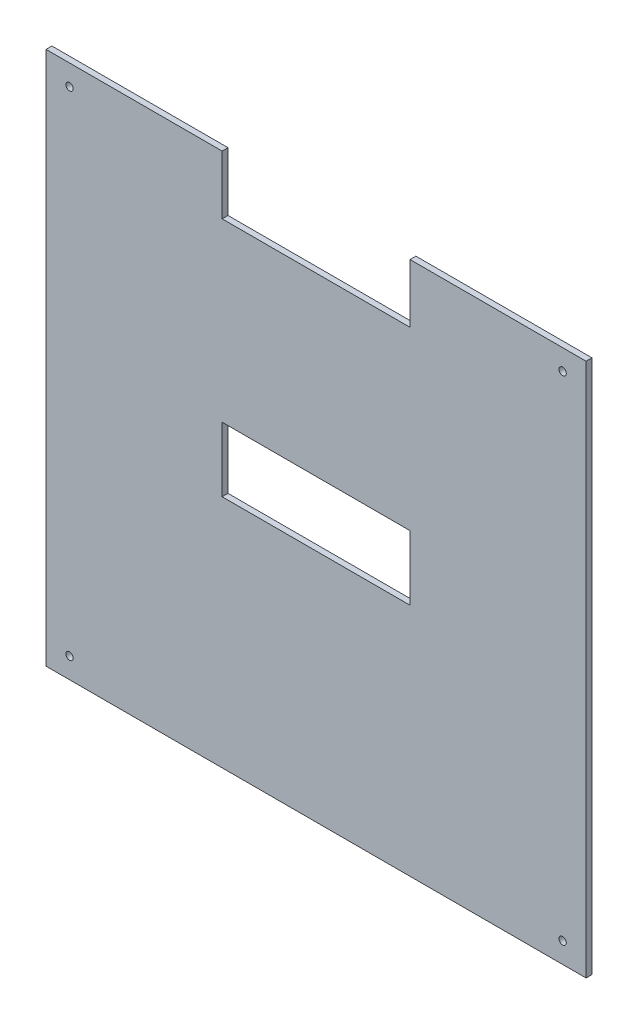
ISO-10303-21;
HEADER;
FILE_DESCRIPTION(('STEP AP214'),'2;1');
FILE_NAME('part.step','',(''),(''),'','','');
FILE_SCHEMA(('AUTOMOTIVE_DESIGN { 1 0 10303 214 1 1 1 1 }'));
ENDSEC;
DATA;
#1=APPLICATION_CONTEXT('core data for automotive mechanical design processes');
#2=APPLICATION_PROTOCOL_DEFINITION('international standard','automotive_design',2000,#1);
#3=PRODUCT_CONTEXT('',#1,'mechanical');
#4=PRODUCT('Part','Part','',(#3));
#5=PRODUCT_RELATED_PRODUCT_CATEGORY('part','',(#4));
#6=PRODUCT_DEFINITION_FORMATION('','',#4);
#7=PRODUCT_DEFINITION_CONTEXT('part definition',#1,'design');
#8=PRODUCT_DEFINITION('design','',#6,#7);
#9=PRODUCT_DEFINITION_SHAPE('','',#8);
#10=(LENGTH_UNIT() NAMED_UNIT(*) SI_UNIT(.MILLI.,.METRE.));
#11=(NAMED_UNIT(*) PLANE_ANGLE_UNIT() SI_UNIT($,.RADIAN.));
#12=(NAMED_UNIT(*) SI_UNIT($,.STERADIAN.) SOLID_ANGLE_UNIT());
#13=UNCERTAINTY_MEASURE_WITH_UNIT(LENGTH_MEASURE(1.E-05),#10,'distance_accuracy_value','');
#14=(GEOMETRIC_REPRESENTATION_CONTEXT(3) GLOBAL_UNCERTAINTY_ASSIGNED_CONTEXT((#13)) GLOBAL_UNIT_ASSIGNED_CONTEXT((#10,
#11,#12)) REPRESENTATION_CONTEXT('',''));
#15=CARTESIAN_POINT('',(0.,0.,0.));
#16=DIRECTION('',(0.,0.,1.));
#17=DIRECTION('',(1.,0.,0.));
#18=AXIS2_PLACEMENT_3D('',#15,#16,#17);
#19=CARTESIAN_POINT('',(0.,182.,2.));
#20=DIRECTION('',(0.,-1.,0.));
#21=DIRECTION('',(0.,0.,-1.));
#22=AXIS2_PLACEMENT_3D('',#19,#20,#21);
#23=PLANE('',#22);
#24=DIRECTION('',(-1.,0.,0.));
#25=VECTOR('',#24,1.);
#26=CARTESIAN_POINT('',(0.,182.,2.));
#27=LINE('',#26,#25);
#28=CARTESIAN_POINT('',(60.,182.,2.));
#29=VERTEX_POINT('',#28);
#30=CARTESIAN_POINT('',(0.,182.,2.));
#31=VERTEX_POINT('',#30);
#32=EDGE_CURVE('E219',#29,#31,#27,.T.);
#33=ORIENTED_EDGE('',*,*,#32,.F.);
#34=DIRECTION('',(0.,0.,-1.));
#35=VECTOR('',#34,1.);
#36=CARTESIAN_POINT('',(60.,182.,2.));
#37=LINE('',#36,#35);
#38=CARTESIAN_POINT('',(60.,182.,0.));
#39=VERTEX_POINT('',#38);
#40=EDGE_CURVE('E171',#29,#39,#37,.T.);
#41=ORIENTED_EDGE('',*,*,#40,.T.);
#42=DIRECTION('',(-1.,0.,0.));
#43=VECTOR('',#42,1.);
#44=CARTESIAN_POINT('',(0.,182.,0.));
#45=LINE('',#44,#43);
#46=CARTESIAN_POINT('',(0.,182.,0.));
#47=VERTEX_POINT('',#46);
#48=EDGE_CURVE('E230',#39,#47,#45,.T.);
#49=ORIENTED_EDGE('',*,*,#48,.T.);
#50=DIRECTION('',(0.,0.,-1.));
#51=VECTOR('',#50,1.);
#52=CARTESIAN_POINT('',(0.,182.,2.));
#53=LINE('',#52,#51);
#54=EDGE_CURVE('E223',#31,#47,#53,.T.);
#55=ORIENTED_EDGE('',*,*,#54,.F.);
#56=EDGE_LOOP('',(#33,#41,#49,#55));
#57=FACE_BOUND('',#56,.T.);
#58=ADVANCED_FACE('F34',(#57),#23,.F.);
#59=CARTESIAN_POINT('',(0.,0.,2.));
#60=DIRECTION('',(0.,0.,-1.));
#61=DIRECTION('',(-1.,0.,0.));
#62=AXIS2_PLACEMENT_3D('',#59,#60,#61);
#63=PLANE('',#62);
#64=DIRECTION('',(1.,0.,0.));
#65=VECTOR('',#64,1.);
#66=CARTESIAN_POINT('',(0.,102.,2.));
#67=LINE('',#66,#65);
#68=CARTESIAN_POINT('',(60.,102.,2.));
#69=VERTEX_POINT('',#68);
#70=CARTESIAN_POINT('',(124.,102.,2.));
#71=VERTEX_POINT('',#70);
#72=EDGE_CURVE('E154',#69,#71,#67,.T.);
#73=ORIENTED_EDGE('',*,*,#72,.T.);
#74=DIRECTION('',(0.,-1.,0.));
#75=VECTOR('',#74,1.);
#76=CARTESIAN_POINT('',(124.,0.,2.));
#77=LINE('',#76,#75);
#78=CARTESIAN_POINT('',(124.,80.,2.));
#79=VERTEX_POINT('',#78);
#80=EDGE_CURVE('E157',#71,#79,#77,.T.);
#81=ORIENTED_EDGE('',*,*,#80,.T.);
#82=DIRECTION('',(-1.,0.,0.));
#83=VECTOR('',#82,1.);
#84=CARTESIAN_POINT('',(0.,80.,2.));
#85=LINE('',#84,#83);
#86=CARTESIAN_POINT('',(60.,80.,2.));
#87=VERTEX_POINT('',#86);
#88=EDGE_CURVE('E149',#79,#87,#85,.T.);
#89=ORIENTED_EDGE('',*,*,#88,.T.);
#90=DIRECTION('',(0.,1.,0.));
#91=VECTOR('',#90,1.);
#92=CARTESIAN_POINT('',(60.,0.,2.));
#93=LINE('',#92,#91);
#94=EDGE_CURVE('E129',#87,#69,#93,.T.);
#95=ORIENTED_EDGE('',*,*,#94,.T.);
#96=EDGE_LOOP('',(#73,#81,#89,#95));
#97=FACE_BOUND('',#96,.T.);
#98=CARTESIAN_POINT('',(8.00000000000001,175.,2.));
#99=DIRECTION('',(0.,0.,1.));
#100=DIRECTION('',(1.,0.,0.));
#101=AXIS2_PLACEMENT_3D('',#98,#99,#100);
#102=CIRCLE('',#101,1.24999999999999);
#103=CARTESIAN_POINT('',(9.24999999999999,175.,2.));
#104=VERTEX_POINT('',#103);
#105=EDGE_CURVE('E180',#104,#104,#102,.T.);
#106=ORIENTED_EDGE('',*,*,#105,.F.);
#107=EDGE_LOOP('',(#106));
#108=FACE_BOUND('',#107,.T.);
#109=CARTESIAN_POINT('',(8.,7.,2.));
#110=DIRECTION('',(0.,0.,1.));
#111=DIRECTION('',(1.,0.,0.));
#112=AXIS2_PLACEMENT_3D('',#109,#110,#111);
#113=CIRCLE('',#112,1.24999999999999);
#114=CARTESIAN_POINT('',(9.24999999999999,7.,2.));
#115=VERTEX_POINT('',#114);
#116=EDGE_CURVE('E192',#115,#115,#113,.T.);
#117=ORIENTED_EDGE('',*,*,#116,.F.);
#118=EDGE_LOOP('',(#117));
#119=FACE_BOUND('',#118,.T.);
#120=CARTESIAN_POINT('',(176.,7.,2.));
#121=DIRECTION('',(0.,0.,1.));
#122=DIRECTION('',(1.,0.,0.));
#123=AXIS2_PLACEMENT_3D('',#120,#121,#122);
#124=CIRCLE('',#123,1.24999999999997);
#125=CARTESIAN_POINT('',(177.25,7.,2.));
#126=VERTEX_POINT('',#125);
#127=EDGE_CURVE('E198',#126,#126,#124,.T.);
#128=ORIENTED_EDGE('',*,*,#127,.F.);
#129=EDGE_LOOP('',(#128));
#130=FACE_BOUND('',#129,.T.);
#131=DIRECTION('',(-1.,0.,0.));
#132=VECTOR('',#131,1.);
#133=CARTESIAN_POINT('',(60.,162.,2.));
#134=LINE('',#133,#132);
#135=CARTESIAN_POINT('',(124.,162.,2.));
#136=VERTEX_POINT('',#135);
#137=CARTESIAN_POINT('',(60.,162.,2.));
#138=VERTEX_POINT('',#137);
#139=EDGE_CURVE('E168',#136,#138,#134,.T.);
#140=ORIENTED_EDGE('',*,*,#139,.T.);
#141=DIRECTION('',(0.,1.,0.));
#142=VECTOR('',#141,1.);
#143=CARTESIAN_POINT('',(60.,182.,2.));
#144=LINE('',#143,#142);
#145=EDGE_CURVE('E161',#138,#29,#144,.T.);
#146=ORIENTED_EDGE('',*,*,#145,.T.);
#147=ORIENTED_EDGE('',*,*,#32,.T.);
#148=DIRECTION('',(0.,-1.,0.));
#149=VECTOR('',#148,1.);
#150=CARTESIAN_POINT('',(0.,0.,2.));
#151=LINE('',#150,#149);
#152=CARTESIAN_POINT('',(0.,0.,2.));
#153=VERTEX_POINT('',#152);
#154=EDGE_CURVE('E211',#31,#153,#151,.T.);
#155=ORIENTED_EDGE('',*,*,#154,.T.);
#156=DIRECTION('',(1.,0.,0.));
#157=VECTOR('',#156,1.);
#158=CARTESIAN_POINT('',(0.,0.,2.));
#159=LINE('',#158,#157);
#160=CARTESIAN_POINT('',(184.,0.,2.));
#161=VERTEX_POINT('',#160);
#162=EDGE_CURVE('E214',#153,#161,#159,.T.);
#163=ORIENTED_EDGE('',*,*,#162,.T.);
#164=DIRECTION('',(0.,1.,0.));
#165=VECTOR('',#164,1.);
#166=CARTESIAN_POINT('',(184.,0.,2.));
#167=LINE('',#166,#165);
#168=CARTESIAN_POINT('',(184.,182.,2.));
#169=VERTEX_POINT('',#168);
#170=EDGE_CURVE('E217',#161,#169,#167,.T.);
#171=ORIENTED_EDGE('',*,*,#170,.T.);
#172=CARTESIAN_POINT('',(124.,182.,2.));
#173=VERTEX_POINT('',#172);
#174=EDGE_CURVE('E220',#169,#173,#27,.T.);
#175=ORIENTED_EDGE('',*,*,#174,.T.);
#176=DIRECTION('',(0.,-1.,0.));
#177=VECTOR('',#176,1.);
#178=CARTESIAN_POINT('',(124.,182.,2.));
#179=LINE('',#178,#177);
#180=EDGE_CURVE('E164',#173,#136,#179,.T.);
#181=ORIENTED_EDGE('',*,*,#180,.T.);
#182=EDGE_LOOP('',(#140,#146,#147,#155,#163,#171,#175,#181));
#183=FACE_BOUND('',#182,.T.);
#184=CARTESIAN_POINT('',(176.,175.,2.));
#185=DIRECTION('',(0.,0.,1.));
#186=DIRECTION('',(1.,0.,0.));
#187=AXIS2_PLACEMENT_3D('',#184,#185,#186);
#188=CIRCLE('',#187,1.24999999999997);
#189=CARTESIAN_POINT('',(177.25,175.,2.));
#190=VERTEX_POINT('',#189);
#191=EDGE_CURVE('E204',#190,#190,#188,.T.);
#192=ORIENTED_EDGE('',*,*,#191,.F.);
#193=EDGE_LOOP('',(#192));
#194=FACE_BOUND('',#193,.T.);
#195=ADVANCED_FACE('F256',(#97,#108,#119,#130,#183,#194),#63,.F.);
#196=CARTESIAN_POINT('',(0.,0.,0.));
#197=DIRECTION('',(0.,0.,-1.));
#198=DIRECTION('',(-1.,0.,0.));
#199=AXIS2_PLACEMENT_3D('',#196,#197,#198);
#200=PLANE('',#199);
#201=DIRECTION('',(0.,-1.,0.));
#202=VECTOR('',#201,1.);
#203=CARTESIAN_POINT('',(124.,102.,0.));
#204=LINE('',#203,#202);
#205=CARTESIAN_POINT('',(124.,102.,0.));
#206=VERTEX_POINT('',#205);
#207=CARTESIAN_POINT('',(124.,80.,0.));
#208=VERTEX_POINT('',#207);
#209=EDGE_CURVE('E57',#206,#208,#204,.T.);
#210=ORIENTED_EDGE('',*,*,#209,.F.);
#211=DIRECTION('',(1.,0.,0.));
#212=VECTOR('',#211,1.);
#213=CARTESIAN_POINT('',(124.,102.,0.));
#214=LINE('',#213,#212);
#215=CARTESIAN_POINT('',(60.,102.,0.));
#216=VERTEX_POINT('',#215);
#217=EDGE_CURVE('E142',#216,#206,#214,.T.);
#218=ORIENTED_EDGE('',*,*,#217,.F.);
#219=DIRECTION('',(0.,1.,0.));
#220=VECTOR('',#219,1.);
#221=CARTESIAN_POINT('',(60.,102.,0.));
#222=LINE('',#221,#220);
#223=CARTESIAN_POINT('',(60.,80.,0.));
#224=VERTEX_POINT('',#223);
#225=EDGE_CURVE('E126',#224,#216,#222,.T.);
#226=ORIENTED_EDGE('',*,*,#225,.F.);
#227=DIRECTION('',(-1.,0.,0.));
#228=VECTOR('',#227,1.);
#229=CARTESIAN_POINT('',(124.,80.,0.));
#230=LINE('',#229,#228);
#231=EDGE_CURVE('E135',#208,#224,#230,.T.);
#232=ORIENTED_EDGE('',*,*,#231,.F.);
#233=EDGE_LOOP('',(#210,#218,#226,#232));
#234=FACE_BOUND('',#233,.T.);
#235=DIRECTION('',(0.,1.,0.));
#236=VECTOR('',#235,1.);
#237=CARTESIAN_POINT('',(60.,182.,0.));
#238=LINE('',#237,#236);
#239=CARTESIAN_POINT('',(60.,162.,0.));
#240=VERTEX_POINT('',#239);
#241=EDGE_CURVE('E160',#240,#39,#238,.T.);
#242=ORIENTED_EDGE('',*,*,#241,.F.);
#243=DIRECTION('',(-1.,0.,0.));
#244=VECTOR('',#243,1.);
#245=CARTESIAN_POINT('',(60.,162.,0.));
#246=LINE('',#245,#244);
#247=CARTESIAN_POINT('',(124.,162.,0.));
#248=VERTEX_POINT('',#247);
#249=EDGE_CURVE('E165',#248,#240,#246,.T.);
#250=ORIENTED_EDGE('',*,*,#249,.F.);
#251=DIRECTION('',(0.,-1.,0.));
#252=VECTOR('',#251,1.);
#253=CARTESIAN_POINT('',(124.,182.,0.));
#254=LINE('',#253,#252);
#255=CARTESIAN_POINT('',(124.,182.,0.));
#256=VERTEX_POINT('',#255);
#257=EDGE_CURVE('E173',#256,#248,#254,.T.);
#258=ORIENTED_EDGE('',*,*,#257,.F.);
#259=CARTESIAN_POINT('',(184.,182.,0.));
#260=VERTEX_POINT('',#259);
#261=EDGE_CURVE('E215',#260,#256,#45,.T.);
#262=ORIENTED_EDGE('',*,*,#261,.F.);
#263=DIRECTION('',(0.,1.,0.));
#264=VECTOR('',#263,1.);
#265=CARTESIAN_POINT('',(184.,0.,0.));
#266=LINE('',#265,#264);
#267=CARTESIAN_POINT('',(184.,0.,0.));
#268=VERTEX_POINT('',#267);
#269=EDGE_CURVE('E228',#268,#260,#266,.T.);
#270=ORIENTED_EDGE('',*,*,#269,.F.);
#271=DIRECTION('',(1.,0.,0.));
#272=VECTOR('',#271,1.);
#273=CARTESIAN_POINT('',(0.,0.,0.));
#274=LINE('',#273,#272);
#275=CARTESIAN_POINT('',(0.,0.,0.));
#276=VERTEX_POINT('',#275);
#277=EDGE_CURVE('E226',#276,#268,#274,.T.);
#278=ORIENTED_EDGE('',*,*,#277,.F.);
#279=DIRECTION('',(0.,-1.,0.));
#280=VECTOR('',#279,1.);
#281=CARTESIAN_POINT('',(0.,0.,0.));
#282=LINE('',#281,#280);
#283=EDGE_CURVE('E210',#47,#276,#282,.T.);
#284=ORIENTED_EDGE('',*,*,#283,.F.);
#285=ORIENTED_EDGE('',*,*,#48,.F.);
#286=EDGE_LOOP('',(#242,#250,#258,#262,#270,#278,#284,#285));
#287=FACE_BOUND('',#286,.T.);
#288=CARTESIAN_POINT('',(8.00000000000001,175.,0.));
#289=DIRECTION('',(0.,0.,1.));
#290=DIRECTION('',(1.,0.,0.));
#291=AXIS2_PLACEMENT_3D('',#288,#289,#290);
#292=CIRCLE('',#291,1.24999999999998);
#293=CARTESIAN_POINT('',(9.24999999999998,175.,0.));
#294=VERTEX_POINT('',#293);
#295=EDGE_CURVE('E189',#294,#294,#292,.T.);
#296=ORIENTED_EDGE('',*,*,#295,.T.);
#297=EDGE_LOOP('',(#296));
#298=FACE_BOUND('',#297,.T.);
#299=CARTESIAN_POINT('',(8.,7.,0.));
#300=DIRECTION('',(0.,0.,1.));
#301=DIRECTION('',(1.,0.,0.));
#302=AXIS2_PLACEMENT_3D('',#299,#300,#301);
#303=CIRCLE('',#302,1.24999999999998);
#304=CARTESIAN_POINT('',(9.24999999999998,7.,0.));
#305=VERTEX_POINT('',#304);
#306=EDGE_CURVE('E195',#305,#305,#303,.T.);
#307=ORIENTED_EDGE('',*,*,#306,.T.);
#308=EDGE_LOOP('',(#307));
#309=FACE_BOUND('',#308,.T.);
#310=CARTESIAN_POINT('',(176.,7.,0.));
#311=DIRECTION('',(0.,0.,1.));
#312=DIRECTION('',(1.,0.,0.));
#313=AXIS2_PLACEMENT_3D('',#310,#311,#312);
#314=CIRCLE('',#313,1.24999999999997);
#315=CARTESIAN_POINT('',(177.25,7.,0.));
#316=VERTEX_POINT('',#315);
#317=EDGE_CURVE('E201',#316,#316,#314,.T.);
#318=ORIENTED_EDGE('',*,*,#317,.T.);
#319=EDGE_LOOP('',(#318));
#320=FACE_BOUND('',#319,.T.);
#321=CARTESIAN_POINT('',(176.,175.,0.));
#322=DIRECTION('',(0.,0.,1.));
#323=DIRECTION('',(1.,0.,0.));
#324=AXIS2_PLACEMENT_3D('',#321,#322,#323);
#325=CIRCLE('',#324,1.24999999999997);
#326=CARTESIAN_POINT('',(177.25,175.,0.));
#327=VERTEX_POINT('',#326);
#328=EDGE_CURVE('E207',#327,#327,#325,.T.);
#329=ORIENTED_EDGE('',*,*,#328,.T.);
#330=EDGE_LOOP('',(#329));
#331=FACE_BOUND('',#330,.T.);
#332=ADVANCED_FACE('F139',(#234,#287,#298,#309,#320,#331),#200,.T.);
#333=CARTESIAN_POINT('',(0.,0.,2.));
#334=DIRECTION('',(1.,0.,0.));
#335=DIRECTION('',(0.,0.,-1.));
#336=AXIS2_PLACEMENT_3D('',#333,#334,#335);
#337=PLANE('',#336);
#338=ORIENTED_EDGE('',*,*,#283,.T.);
#339=DIRECTION('',(0.,0.,-1.));
#340=VECTOR('',#339,1.);
#341=CARTESIAN_POINT('',(0.,0.,2.));
#342=LINE('',#341,#340);
#343=EDGE_CURVE('E11',#153,#276,#342,.T.);
#344=ORIENTED_EDGE('',*,*,#343,.F.);
#345=ORIENTED_EDGE('',*,*,#154,.F.);
#346=ORIENTED_EDGE('',*,*,#54,.T.);
#347=EDGE_LOOP('',(#338,#344,#345,#346));
#348=FACE_BOUND('',#347,.T.);
#349=ADVANCED_FACE('F36',(#348),#337,.F.);
#350=CARTESIAN_POINT('',(0.,0.,2.));
#351=DIRECTION('',(0.,1.,0.));
#352=DIRECTION('',(0.,0.,1.));
#353=AXIS2_PLACEMENT_3D('',#350,#351,#352);
#354=PLANE('',#353);
#355=ORIENTED_EDGE('',*,*,#277,.T.);
#356=DIRECTION('',(0.,0.,-1.));
#357=VECTOR('',#356,1.);
#358=CARTESIAN_POINT('',(184.,0.,2.));
#359=LINE('',#358,#357);
#360=EDGE_CURVE('E42',#161,#268,#359,.T.);
#361=ORIENTED_EDGE('',*,*,#360,.F.);
#362=ORIENTED_EDGE('',*,*,#162,.F.);
#363=ORIENTED_EDGE('',*,*,#343,.T.);
#364=EDGE_LOOP('',(#355,#361,#362,#363));
#365=FACE_BOUND('',#364,.T.);
#366=ADVANCED_FACE('F260',(#365),#354,.F.);
#367=CARTESIAN_POINT('',(184.,0.,2.));
#368=DIRECTION('',(-1.,0.,0.));
#369=DIRECTION('',(0.,0.,1.));
#370=AXIS2_PLACEMENT_3D('',#367,#368,#369);
#371=PLANE('',#370);
#372=ORIENTED_EDGE('',*,*,#269,.T.);
#373=DIRECTION('',(0.,0.,-1.));
#374=VECTOR('',#373,1.);
#375=CARTESIAN_POINT('',(184.,182.,2.));
#376=LINE('',#375,#374);
#377=EDGE_CURVE('E235',#169,#260,#376,.T.);
#378=ORIENTED_EDGE('',*,*,#377,.F.);
#379=ORIENTED_EDGE('',*,*,#170,.F.);
#380=ORIENTED_EDGE('',*,*,#360,.T.);
#381=EDGE_LOOP('',(#372,#378,#379,#380));
#382=FACE_BOUND('',#381,.T.);
#383=ADVANCED_FACE('F242',(#382),#371,.F.);
#384=ORIENTED_EDGE('',*,*,#261,.T.);
#385=DIRECTION('',(0.,0.,-1.));
#386=VECTOR('',#385,1.);
#387=CARTESIAN_POINT('',(124.,182.,2.));
#388=LINE('',#387,#386);
#389=EDGE_CURVE('E183',#173,#256,#388,.T.);
#390=ORIENTED_EDGE('',*,*,#389,.F.);
#391=ORIENTED_EDGE('',*,*,#174,.F.);
#392=ORIENTED_EDGE('',*,*,#377,.T.);
#393=EDGE_LOOP('',(#384,#390,#391,#392));
#394=FACE_BOUND('',#393,.T.);
#395=ADVANCED_FACE('F253',(#394),#23,.F.);
#396=CARTESIAN_POINT('',(176.,175.,2.));
#397=DIRECTION('',(0.,0.,1.));
#398=DIRECTION('',(1.,0.,0.));
#399=AXIS2_PLACEMENT_3D('',#396,#397,#398);
#400=CYLINDRICAL_SURFACE('',#399,1.24999999999997);
#401=ORIENTED_EDGE('',*,*,#328,.F.);
#402=EDGE_LOOP('',(#401));
#403=FACE_BOUND('',#402,.T.);
#404=ORIENTED_EDGE('',*,*,#191,.T.);
#405=EDGE_LOOP('',(#404));
#406=FACE_BOUND('',#405,.T.);
#407=ADVANCED_FACE('F295',(#403,#406),#400,.F.);
#408=CARTESIAN_POINT('',(176.,7.,2.));
#409=DIRECTION('',(0.,0.,1.));
#410=DIRECTION('',(1.,0.,0.));
#411=AXIS2_PLACEMENT_3D('',#408,#409,#410);
#412=CYLINDRICAL_SURFACE('',#411,1.24999999999997);
#413=ORIENTED_EDGE('',*,*,#317,.F.);
#414=EDGE_LOOP('',(#413));
#415=FACE_BOUND('',#414,.T.);
#416=ORIENTED_EDGE('',*,*,#127,.T.);
#417=EDGE_LOOP('',(#416));
#418=FACE_BOUND('',#417,.T.);
#419=ADVANCED_FACE('F300',(#415,#418),#412,.F.);
#420=CARTESIAN_POINT('',(8.,7.,2.));
#421=DIRECTION('',(0.,0.,1.));
#422=DIRECTION('',(1.,0.,0.));
#423=AXIS2_PLACEMENT_3D('',#420,#421,#422);
#424=CYLINDRICAL_SURFACE('',#423,1.24999999999998);
#425=ORIENTED_EDGE('',*,*,#306,.F.);
#426=EDGE_LOOP('',(#425));
#427=FACE_BOUND('',#426,.T.);
#428=ORIENTED_EDGE('',*,*,#116,.T.);
#429=EDGE_LOOP('',(#428));
#430=FACE_BOUND('',#429,.T.);
#431=ADVANCED_FACE('F317',(#427,#430),#424,.F.);
#432=CARTESIAN_POINT('',(8.00000000000001,175.,2.));
#433=DIRECTION('',(0.,0.,1.));
#434=DIRECTION('',(1.,0.,0.));
#435=AXIS2_PLACEMENT_3D('',#432,#433,#434);
#436=CYLINDRICAL_SURFACE('',#435,1.24999999999998);
#437=ORIENTED_EDGE('',*,*,#295,.F.);
#438=EDGE_LOOP('',(#437));
#439=FACE_BOUND('',#438,.T.);
#440=ORIENTED_EDGE('',*,*,#105,.T.);
#441=EDGE_LOOP('',(#440));
#442=FACE_BOUND('',#441,.T.);
#443=ADVANCED_FACE('F321',(#439,#442),#436,.F.);
#444=CARTESIAN_POINT('',(60.,182.,2.));
#445=DIRECTION('',(-1.,0.,0.));
#446=DIRECTION('',(0.,0.,1.));
#447=AXIS2_PLACEMENT_3D('',#444,#445,#446);
#448=PLANE('',#447);
#449=ORIENTED_EDGE('',*,*,#241,.T.);
#450=ORIENTED_EDGE('',*,*,#40,.F.);
#451=ORIENTED_EDGE('',*,*,#145,.F.);
#452=DIRECTION('',(0.,0.,-1.));
#453=VECTOR('',#452,1.);
#454=CARTESIAN_POINT('',(60.,162.,2.));
#455=LINE('',#454,#453);
#456=EDGE_CURVE('E178',#138,#240,#455,.T.);
#457=ORIENTED_EDGE('',*,*,#456,.T.);
#458=EDGE_LOOP('',(#449,#450,#451,#457));
#459=FACE_BOUND('',#458,.T.);
#460=ADVANCED_FACE('F268',(#459),#448,.F.);
#461=CARTESIAN_POINT('',(60.,162.,2.));
#462=DIRECTION('',(0.,-1.,0.));
#463=DIRECTION('',(0.,0.,-1.));
#464=AXIS2_PLACEMENT_3D('',#461,#462,#463);
#465=PLANE('',#464);
#466=ORIENTED_EDGE('',*,*,#249,.T.);
#467=ORIENTED_EDGE('',*,*,#456,.F.);
#468=ORIENTED_EDGE('',*,*,#139,.F.);
#469=DIRECTION('',(0.,0.,-1.));
#470=VECTOR('',#469,1.);
#471=CARTESIAN_POINT('',(124.,162.,2.));
#472=LINE('',#471,#470);
#473=EDGE_CURVE('E181',#136,#248,#472,.T.);
#474=ORIENTED_EDGE('',*,*,#473,.T.);
#475=EDGE_LOOP('',(#466,#467,#468,#474));
#476=FACE_BOUND('',#475,.T.);
#477=ADVANCED_FACE('F271',(#476),#465,.F.);
#478=CARTESIAN_POINT('',(124.,182.,2.));
#479=DIRECTION('',(1.,0.,0.));
#480=DIRECTION('',(0.,1.,0.));
#481=AXIS2_PLACEMENT_3D('',#478,#479,#480);
#482=PLANE('',#481);
#483=ORIENTED_EDGE('',*,*,#257,.T.);
#484=ORIENTED_EDGE('',*,*,#473,.F.);
#485=ORIENTED_EDGE('',*,*,#180,.F.);
#486=ORIENTED_EDGE('',*,*,#389,.T.);
#487=EDGE_LOOP('',(#483,#484,#485,#486));
#488=FACE_BOUND('',#487,.T.);
#489=ADVANCED_FACE('F273',(#488),#482,.F.);
#490=CARTESIAN_POINT('',(124.,102.,10.));
#491=DIRECTION('',(1.,0.,0.));
#492=DIRECTION('',(0.,0.,-1.));
#493=AXIS2_PLACEMENT_3D('',#490,#491,#492);
#494=PLANE('',#493);
#495=DIRECTION('',(0.,0.,-1.));
#496=VECTOR('',#495,1.);
#497=CARTESIAN_POINT('',(124.,102.,10.));
#498=LINE('',#497,#496);
#499=EDGE_CURVE('E147',#71,#206,#498,.T.);
#500=ORIENTED_EDGE('',*,*,#499,.T.);
#501=ORIENTED_EDGE('',*,*,#209,.T.);
#502=DIRECTION('',(0.,0.,-1.));
#503=VECTOR('',#502,1.);
#504=CARTESIAN_POINT('',(124.,80.,10.));
#505=LINE('',#504,#503);
#506=EDGE_CURVE('E132',#79,#208,#505,.T.);
#507=ORIENTED_EDGE('',*,*,#506,.F.);
#508=ORIENTED_EDGE('',*,*,#80,.F.);
#509=EDGE_LOOP('',(#500,#501,#507,#508));
#510=FACE_BOUND('',#509,.T.);
#511=ADVANCED_FACE('F275',(#510),#494,.F.);
#512=CARTESIAN_POINT('',(124.,102.,10.));
#513=DIRECTION('',(0.,1.,0.));
#514=DIRECTION('',(0.,0.,1.));
#515=AXIS2_PLACEMENT_3D('',#512,#513,#514);
#516=PLANE('',#515);
#517=DIRECTION('',(0.,0.,-1.));
#518=VECTOR('',#517,1.);
#519=CARTESIAN_POINT('',(60.,102.,10.));
#520=LINE('',#519,#518);
#521=EDGE_CURVE('E131',#69,#216,#520,.T.);
#522=ORIENTED_EDGE('',*,*,#521,.T.);
#523=ORIENTED_EDGE('',*,*,#217,.T.);
#524=ORIENTED_EDGE('',*,*,#499,.F.);
#525=ORIENTED_EDGE('',*,*,#72,.F.);
#526=EDGE_LOOP('',(#522,#523,#524,#525));
#527=FACE_BOUND('',#526,.T.);
#528=ADVANCED_FACE('F281',(#527),#516,.F.);
#529=CARTESIAN_POINT('',(60.,102.,10.));
#530=DIRECTION('',(-1.,0.,0.));
#531=DIRECTION('',(0.,0.,1.));
#532=AXIS2_PLACEMENT_3D('',#529,#530,#531);
#533=PLANE('',#532);
#534=DIRECTION('',(0.,0.,-1.));
#535=VECTOR('',#534,1.);
#536=CARTESIAN_POINT('',(60.,80.,10.));
#537=LINE('',#536,#535);
#538=EDGE_CURVE('E49',#87,#224,#537,.T.);
#539=ORIENTED_EDGE('',*,*,#538,.T.);
#540=ORIENTED_EDGE('',*,*,#225,.T.);
#541=ORIENTED_EDGE('',*,*,#521,.F.);
#542=ORIENTED_EDGE('',*,*,#94,.F.);
#543=EDGE_LOOP('',(#539,#540,#541,#542));
#544=FACE_BOUND('',#543,.T.);
#545=ADVANCED_FACE('F123',(#544),#533,.F.);
#546=CARTESIAN_POINT('',(124.,80.,10.));
#547=DIRECTION('',(0.,-1.,0.));
#548=DIRECTION('',(0.,0.,-1.));
#549=AXIS2_PLACEMENT_3D('',#546,#547,#548);
#550=PLANE('',#549);
#551=ORIENTED_EDGE('',*,*,#506,.T.);
#552=ORIENTED_EDGE('',*,*,#231,.T.);
#553=ORIENTED_EDGE('',*,*,#538,.F.);
#554=ORIENTED_EDGE('',*,*,#88,.F.);
#555=EDGE_LOOP('',(#551,#552,#553,#554));
#556=FACE_BOUND('',#555,.T.);
#557=ADVANCED_FACE('F136',(#556),#550,.F.);
#558=CLOSED_SHELL('',(#58,#195,#332,#349,#366,#383,#395,#407,#419,#431,#443,#460,#477,#489,#511,
#528,#545,#557));
#559=MANIFOLD_SOLID_BREP('B2',#558);
#560=ADVANCED_BREP_SHAPE_REPRESENTATION('',(#18,#559),#14);
#561=SHAPE_DEFINITION_REPRESENTATION(#9,#560);
ENDSEC;
END-ISO-10303-21;
